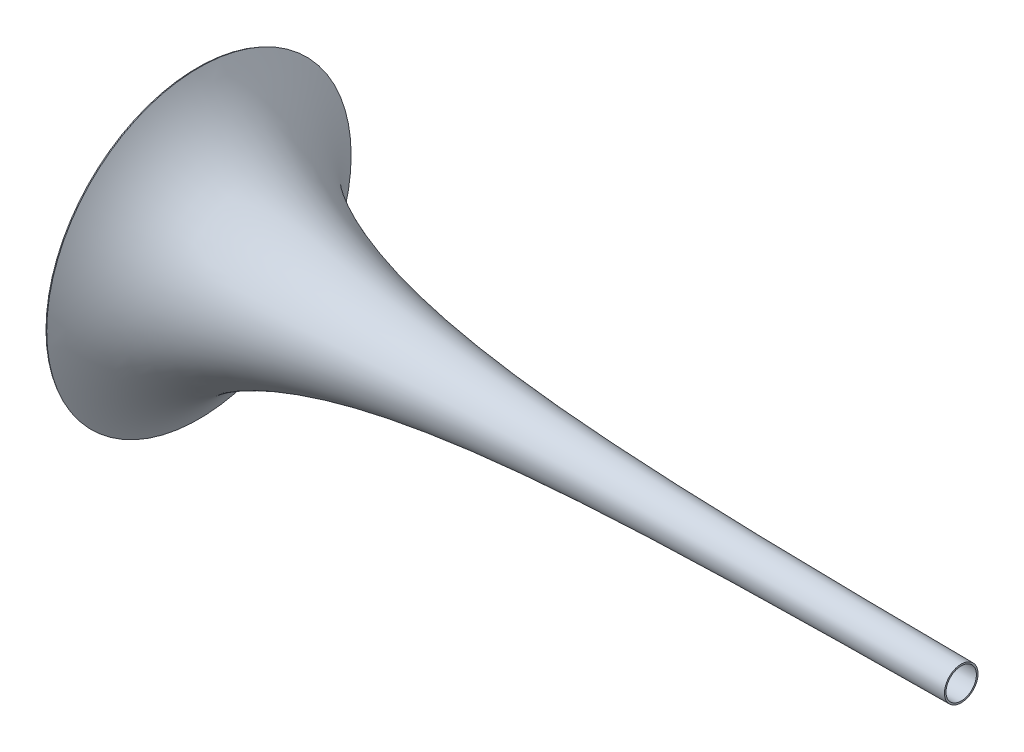
ISO-10303-21;
HEADER;
FILE_DESCRIPTION(('STEP AP214'),'2;1');
FILE_NAME('part.step','',(''),(''),'','','');
FILE_SCHEMA(('AUTOMOTIVE_DESIGN { 1 0 10303 214 1 1 1 1 }'));
ENDSEC;
DATA;
#1=APPLICATION_CONTEXT('core data for automotive mechanical design processes');
#2=APPLICATION_PROTOCOL_DEFINITION('international standard','automotive_design',2000,#1);
#3=PRODUCT_CONTEXT('',#1,'mechanical');
#4=PRODUCT('Part','Part','',(#3));
#5=PRODUCT_RELATED_PRODUCT_CATEGORY('part','',(#4));
#6=PRODUCT_DEFINITION_FORMATION('','',#4);
#7=PRODUCT_DEFINITION_CONTEXT('part definition',#1,'design');
#8=PRODUCT_DEFINITION('design','',#6,#7);
#9=PRODUCT_DEFINITION_SHAPE('','',#8);
#10=(LENGTH_UNIT() NAMED_UNIT(*) SI_UNIT(.MILLI.,.METRE.));
#11=(NAMED_UNIT(*) PLANE_ANGLE_UNIT() SI_UNIT($,.RADIAN.));
#12=(NAMED_UNIT(*) SI_UNIT($,.STERADIAN.) SOLID_ANGLE_UNIT());
#13=UNCERTAINTY_MEASURE_WITH_UNIT(LENGTH_MEASURE(1.E-05),#10,'distance_accuracy_value','');
#14=(GEOMETRIC_REPRESENTATION_CONTEXT(3) GLOBAL_UNCERTAINTY_ASSIGNED_CONTEXT((#13)) GLOBAL_UNIT_ASSIGNED_CONTEXT((#10,
#11,#12)) REPRESENTATION_CONTEXT('',''));
#15=CARTESIAN_POINT('',(0.,0.,0.));
#16=DIRECTION('',(0.,0.,1.));
#17=DIRECTION('',(1.,0.,0.));
#18=AXIS2_PLACEMENT_3D('',#15,#16,#17);
#19=CARTESIAN_POINT('',(58.3007590635035,240.362898059612,0.));
#20=CARTESIAN_POINT('',(58.3811556590823,240.208032578408,0.));
#21=CARTESIAN_POINT('',(58.4618255709949,240.05317555378,0.));
#22=CARTESIAN_POINT('',(58.6389810626078,239.714057614751,0.));
#23=CARTESIAN_POINT('',(58.7355060287095,239.529719983446,0.));
#24=CARTESIAN_POINT('',(58.9404247464375,239.139248908027,0.));
#25=CARTESIAN_POINT('',(59.0476713787615,238.93532642151,0.));
#26=CARTESIAN_POINT('',(59.2593173235424,238.534046893683,0.));
#27=CARTESIAN_POINT('',(59.3637189628084,238.336686104393,0.));
#28=CARTESIAN_POINT('',(59.6683203095675,237.762803565129,0.));
#29=CARTESIAN_POINT('',(59.8620213861742,237.400415751915,0.));
#30=CARTESIAN_POINT('',(60.2526790011554,236.673675883246,0.));
#31=CARTESIAN_POINT('',(60.449096364017,236.310365992973,0.));
#32=CARTESIAN_POINT('',(61.0454262743039,235.213331277926,0.));
#33=CARTESIAN_POINT('',(61.4491794036923,234.47876494683,0.));
#34=CARTESIAN_POINT('',(62.2602268986225,233.020407024892,0.));
#35=CARTESIAN_POINT('',(62.6690688572317,232.293635138643,0.));
#36=CARTESIAN_POINT('',(64.7324101551609,228.667372884224,0.));
#37=CARTESIAN_POINT('',(66.4403642012414,225.798396230359,0.));
#38=CARTESIAN_POINT('',(71.7379740585548,217.297751923055,0.));
#39=CARTESIAN_POINT('',(75.5021072766863,211.772879202369,0.));
#40=CARTESIAN_POINT('',(83.4850613066661,201.059860162265,0.));
#41=CARTESIAN_POINT('',(87.7037385987146,195.871972165719,0.));
#42=CARTESIAN_POINT('',(96.5617929631152,185.87117672618,0.));
#43=CARTESIAN_POINT('',(101.200867249609,181.05835887553,0.));
#44=CARTESIAN_POINT('',(110.848689135951,171.825694519124,0.));
#45=CARTESIAN_POINT('',(115.857118928575,167.405760933959,0.));
#46=CARTESIAN_POINT('',(126.185416928655,158.956722137601,0.));
#47=CARTESIAN_POINT('',(131.505063757293,154.927431216566,0.));
#48=CARTESIAN_POINT('',(142.398881913579,147.241977464485,0.));
#49=CARTESIAN_POINT('',(147.972948789719,143.585615267406,0.));
#50=CARTESIAN_POINT('',(159.325176313307,136.618849161909,0.));
#51=CARTESIAN_POINT('',(165.103310487505,133.308295545031,0.));
#52=CARTESIAN_POINT('',(182.68075255756,123.848622277309,0.));
#53=CARTESIAN_POINT('',(194.719581958526,118.170361539033,0.));
#54=CARTESIAN_POINT('',(219.196446604634,107.823630364644,0.));
#55=CARTESIAN_POINT('',(231.635829590152,103.154449762443,0.));
#56=CARTESIAN_POINT('',(256.768297125278,94.617623546846,0.));
#57=CARTESIAN_POINT('',(269.462374835359,90.750138483022,0.));
#58=CARTESIAN_POINT('',(295.015775870777,83.656061297687,0.));
#59=CARTESIAN_POINT('',(307.875707193234,80.4298010844057,0.));
#60=CARTESIAN_POINT('',(333.705738258228,74.4957044880951,0.));
#61=CARTESIAN_POINT('',(346.676181359355,71.7881587874927,0.));
#62=CARTESIAN_POINT('',(372.691928590467,66.7973155372779,0.));
#63=CARTESIAN_POINT('',(385.737429957326,64.5142298111218,0.));
#64=CARTESIAN_POINT('',(411.880069958842,60.2987643127749,0.));
#65=CARTESIAN_POINT('',(424.977319077214,58.3665357422759,0.));
#66=CARTESIAN_POINT('',(451.207807854972,54.7943531468981,0.));
#67=CARTESIAN_POINT('',(464.341130258902,53.154528880044,0.));
#68=CARTESIAN_POINT('',(503.778986411795,48.60280466089,0.));
#69=CARTESIAN_POINT('',(530.120479306056,46.0555754558742,0.));
#70=CARTESIAN_POINT('',(582.851716023541,41.6541098623076,0.));
#71=CARTESIAN_POINT('',(609.242085359218,39.8011831885346,0.));
#72=CARTESIAN_POINT('',(662.046919737057,36.5959309936685,0.));
#73=CARTESIAN_POINT('',(688.461692505241,35.2443544973711,0.));
#74=CARTESIAN_POINT('',(741.303070653338,32.9049873321992,0.));
#75=CARTESIAN_POINT('',(767.729811124051,31.9176559737006,0.));
#76=CARTESIAN_POINT('',(820.588942664535,30.2081784018472,0.));
#77=CARTESIAN_POINT('',(847.021308635307,29.4863429840032,0.));
#78=CARTESIAN_POINT('',(899.88877370163,28.2363321127112,0.));
#79=CARTESIAN_POINT('',(926.324008382258,27.7083679580588,0.));
#80=CARTESIAN_POINT('',(979.194073970992,26.7940029368593,0.));
#81=CARTESIAN_POINT('',(1005.62877944288,26.4077544337508,0.));
#82=CARTESIAN_POINT('',(1045.28548196562,25.9060047136089,0.));
#83=CARTESIAN_POINT('',(1058.50090791675,25.7518094980305,0.));
#84=CARTESIAN_POINT('',(1078.32872234412,25.5372147422712,0.));
#85=CARTESIAN_POINT('',(1084.93960528081,25.4684667624722,0.));
#86=CARTESIAN_POINT('',(1098.15894333797,25.3361461389961,0.));
#87=CARTESIAN_POINT('',(1104.7662534719,25.2725792736864,0.));
#88=CARTESIAN_POINT('',(1117.98037053389,25.1502231172637,0.));
#89=CARTESIAN_POINT('',(1124.58949355124,25.0914224602634,0.));
#90=CARTESIAN_POINT('',(1137.8141150657,24.9782059069842,0.));
#91=CARTESIAN_POINT('',(1144.42708684544,24.9238025905773,0.));
#92=CARTESIAN_POINT('',(1157.6349035445,24.8191702794917,0.));
#93=CARTESIAN_POINT('',(1164.23018732821,24.7689391135334,0.));
#94=CARTESIAN_POINT('',(1174.16330219104,24.6962262893082,0.));
#95=CARTESIAN_POINT('',(1177.48177666189,24.6724242203962,0.));
#96=CARTESIAN_POINT('',(1182.44061963226,24.6374961342071,0.));
#97=CARTESIAN_POINT('',(1185.73889814616,24.6144756760926,0.));
#98=CARTESIAN_POINT('',(1189.02279561987,24.5919720309961,0.));
#99=CARTESIAN_POINT('',(1192.30914843254,24.5696746541531,0.));
#100=CARTESIAN_POINT('',(1193.9543558184,24.5586251150736,0.));
#101=CARTESIAN_POINT('',(1197.26094637581,24.5366600860382,0.));
#102=CARTESIAN_POINT('',(1198.9224031497,24.5257442323717,0.));
#103=CARTESIAN_POINT('',(1202.25592602421,24.5040700501987,0.));
#104=CARTESIAN_POINT('',(1203.92798277912,24.4933117679871,0.));
#105=CARTESIAN_POINT('',(1207.25872319098,24.4720675693798,0.));
#106=CARTESIAN_POINT('',(1210.57209411434,24.4511155431948,0.));
#107=CARTESIAN_POINT('',(1213.82786304065,24.4308531710231,0.));
#108=CARTESIAN_POINT('',(1217.07603952908,24.4108265549705,0.));
#109=CARTESIAN_POINT('',(1218.69741110453,24.4009257698707,0.));
#110=CARTESIAN_POINT('',(1221.98085391061,24.3811167281522,0.));
#111=CARTESIAN_POINT('',(1225.30748381615,24.3612878931083,0.));
#112=CARTESIAN_POINT('',(1228.71783523298,24.3414251553358,0.));
#113=CARTESIAN_POINT('',(1232.11222683049,24.3218284420488,0.));
#114=CARTESIAN_POINT('',(1233.79554731359,24.3121923265476,0.));
#115=CARTESIAN_POINT('',(1237.07718207457,24.2935247856081,0.));
#116=CARTESIAN_POINT('',(1238.67543753232,24.2844936515101,0.));
#117=CARTESIAN_POINT('',(1241.82854114368,24.2668262766595,0.));
#118=CARTESIAN_POINT('',(1243.38390410035,24.2581874824874,0.));
#119=CARTESIAN_POINT('',(1245.78845890248,24.2450069390734,0.));
#120=CARTESIAN_POINT('',(1247.4168875378,24.2361380851561,0.));
#121=CARTESIAN_POINT('',(1249.96777987332,24.2224290474743,0.));
#122=CARTESIAN_POINT('',(1252.62813907133,24.2083069467681,0.));
#123=CARTESIAN_POINT('',(1254.45492846402,24.1987139671169,0.));
#124=CARTESIAN_POINT('',(1257.20477247859,24.1843401712367,0.));
#125=CARTESIAN_POINT('',(1259.04800089915,24.1747928192961,0.));
#126=CARTESIAN_POINT('',(1261.66084989858,24.1613499941091,0.));
#127=CARTESIAN_POINT('',(1263.35416888122,24.1526705131242,0.));
#128=CARTESIAN_POINT('',(1265.71815686696,24.1406472551907,0.));
#129=CARTESIAN_POINT('',(1267.91554341962,24.1295722145252,0.));
#130=CARTESIAN_POINT('',(1269.30208147378,24.1226581847067,0.));
#131=CARTESIAN_POINT('',(1269.99052880498,24.1192450572717,0.));
#132=B_SPLINE_CURVE_WITH_KNOTS('',3,(#19,#20,#21,#22,#23,#24,#25,#26,#27,#28,#29,#30,#31,#32,
#33,#34,#35,#36,#37,#38,#39,#40,#41,#42,#43,#44,#45,#46,#47,#48,#49,#50,#51,#52,#53,#54,#55,#56,
#57,#58,#59,#60,#61,#62,#63,#64,#65,#66,#67,#68,#69,#70,#71,#72,#73,#74,#75,#76,#77,#78,#79,#80,
#81,#82,#83,#84,#85,#86,#87,#88,#89,#90,#91,#92,#93,#94,#95,#96,#97,#98,#99,#100,#101,#102,#103,
#104,#105,#106,#107,#108,#109,#110,#111,#112,#113,#114,#115,#116,#117,#118,#119,#120,#121,#122,
#123,#124,#125,#126,#127,#128,#129,#130,#131),.UNSPECIFIED.,.F.,.F.,(4,2,2,2,2,2,2,2,2,2,2,2,2,
2,2,2,2,2,2,2,2,2,2,2,2,2,2,2,2,2,2,2,2,2,2,2,2,2,2,1,2,2,2,2,1,2,2,1,2,2,2,2,1,1,1,2,2,1,1,1,
4),(0.,0.000488281249999985,0.000976562499999969,0.00146484374999995,0.00195312499999994,
0.00292968749999992,0.00390624999999989,0.00585937499999991,0.00781249999999993,
0.0156249999999999,0.03125,0.046875,0.0625000000000001,0.0781250000000002,0.0937500000000002,
0.109375,0.125,0.15625,0.187500000000001,0.218750000000001,0.250000000000001,0.281250000000001,
0.312500000000001,0.343750000000001,0.375000000000002,0.437500000000002,0.500000000000002,
0.562500000000003,0.625000000000003,0.687500000000003,0.750000000000004,0.812500000000004,
0.843750000000004,0.859375000000004,0.875000000000004,0.890625000000004,0.906250000000004,
0.921875000000004,0.929687500000004,0.933593750000004,0.937500000000004,0.941406250000004,
0.945312500000004,0.949218750000004,0.953125000000004,0.957031250000004,0.960937500000004,
0.964843750000004,0.968750000000004,0.972656250000004,0.976562500000004,0.980468750000004,
0.982421875000003,0.984375000000003,0.986328125000003,0.988281250000003,0.992187500000002,
0.994140625000002,0.996093750000001,0.998046875000001,1.),.UNSPECIFIED.);
#133=CARTESIAN_POINT('',(0.,0.,0.));
#134=DIRECTION('',(-1.,0.,0.));
#135=AXIS1_PLACEMENT('',#133,#134);
#136=SURFACE_OF_REVOLUTION('',#132,#135);
#137=CARTESIAN_POINT('',(1269.99052880498,0.,0.));
#138=DIRECTION('',(-1.,0.,0.));
#139=DIRECTION('',(0.,0.,1.));
#140=AXIS2_PLACEMENT_3D('',#137,#138,#139);
#141=CIRCLE('',#140,24.1192450572717);
#142=CARTESIAN_POINT('',(1269.99052880498,0.,24.1192450572717));
#143=VERTEX_POINT('',#142);
#144=EDGE_CURVE('E52',#143,#143,#141,.T.);
#145=ORIENTED_EDGE('',*,*,#144,.F.);
#146=EDGE_LOOP('',(#145));
#147=FACE_BOUND('',#146,.T.);
#148=CARTESIAN_POINT('',(58.3007590635035,0.,0.));
#149=DIRECTION('',(-1.,0.,0.));
#150=DIRECTION('',(0.,0.,1.));
#151=AXIS2_PLACEMENT_3D('',#148,#149,#150);
#152=CIRCLE('',#151,240.362898059612);
#153=CARTESIAN_POINT('',(58.3007590635035,0.,240.362898059612));
#154=VERTEX_POINT('',#153);
#155=EDGE_CURVE('E10',#154,#154,#152,.T.);
#156=ORIENTED_EDGE('',*,*,#155,.T.);
#157=EDGE_LOOP('',(#156));
#158=FACE_BOUND('',#157,.T.);
#159=ADVANCED_FACE('F37',(#147,#158),#136,.T.);
#160=CARTESIAN_POINT('',(58.3007590635035,0.,0.));
#161=DIRECTION('',(1.,0.,0.));
#162=DIRECTION('',(0.,0.,-1.));
#163=AXIS2_PLACEMENT_3D('',#160,#161,#162);
#164=CONICAL_SURFACE('',#163,240.362898059612,0.478840726548642);
#165=CARTESIAN_POINT('',(60.5550843871405,0.,0.));
#166=DIRECTION('',(-1.,0.,0.));
#167=DIRECTION('',(0.,0.,1.));
#168=AXIS2_PLACEMENT_3D('',#165,#166,#167);
#169=CIRCLE('',#168,241.533204572971);
#170=CARTESIAN_POINT('',(60.5550843871405,0.,241.533204572971));
#171=VERTEX_POINT('',#170);
#172=EDGE_CURVE('E44',#171,#171,#169,.T.);
#173=ORIENTED_EDGE('',*,*,#172,.T.);
#174=EDGE_LOOP('',(#173));
#175=FACE_BOUND('',#174,.T.);
#176=ORIENTED_EDGE('',*,*,#155,.F.);
#177=EDGE_LOOP('',(#176));
#178=FACE_BOUND('',#177,.T.);
#179=ADVANCED_FACE('F71',(#175,#178),#164,.T.);
#180=CARTESIAN_POINT('',(60.5550843871405,241.533204572971,0.));
#181=CARTESIAN_POINT('',(60.6798004197543,241.292967927805,0.));
#182=CARTESIAN_POINT('',(60.9268998777238,240.819305161917,0.));
#183=CARTESIAN_POINT('',(61.4683401672404,239.786795038937,0.));
#184=CARTESIAN_POINT('',(62.075343276486,238.645508970347,0.));
#185=CARTESIAN_POINT('',(62.6814842012742,237.519999385753,0.));
#186=CARTESIAN_POINT('',(63.3054369142382,236.374376324269,0.));
#187=CARTESIAN_POINT('',(64.0901510414127,234.950997750834,0.));
#188=CARTESIAN_POINT('',(64.8832797586592,233.535331464959,0.));
#189=CARTESIAN_POINT('',(65.6870510877671,232.123272080324,0.));
#190=CARTESIAN_POINT('',(66.5001035935157,230.717616607584,0.));
#191=CARTESIAN_POINT('',(67.1564851997875,229.596287440143,0.));
#192=CARTESIAN_POINT('',(68.97750331049,226.522289621016,0.));
#193=CARTESIAN_POINT('',(71.3634190300392,222.650666100551,0.));
#194=CARTESIAN_POINT('',(75.076113106732,216.927400250088,0.));
#195=CARTESIAN_POINT('',(80.299935972225,209.481066006704,0.));
#196=CARTESIAN_POINT('',(85.7947830853089,202.230965947502,0.));
#197=CARTESIAN_POINT('',(92.4364750557776,194.232213331404,0.));
#198=CARTESIAN_POINT('',(99.4252247027236,186.534903952961,0.));
#199=CARTESIAN_POINT('',(106.747270504137,179.144019682604,0.));
#200=CARTESIAN_POINT('',(114.381585914104,172.065867259374,0.));
#201=CARTESIAN_POINT('',(121.558417054532,165.939860904545,0.));
#202=CARTESIAN_POINT('',(128.178426896589,160.671887885884,0.));
#203=CARTESIAN_POINT('',(135.458309115305,155.208136819421,0.));
#204=CARTESIAN_POINT('',(143.49275243462,149.55150037106,0.));
#205=CARTESIAN_POINT('',(153.157183859525,143.260406688952,0.));
#206=CARTESIAN_POINT('',(163.534502424247,137.091050501444,0.));
#207=CARTESIAN_POINT('',(173.161931491538,131.793754823868,0.));
#208=CARTESIAN_POINT('',(183.819222578451,126.299143534236,0.));
#209=CARTESIAN_POINT('',(196.061387051647,120.428080454601,0.));
#210=CARTESIAN_POINT('',(211.020604569677,113.885173533524,0.));
#211=CARTESIAN_POINT('',(227.226930493128,107.524529724196,0.));
#212=CARTESIAN_POINT('',(242.602057311586,102.036560222189,0.));
#213=CARTESIAN_POINT('',(256.524345971449,97.4495074708119,0.));
#214=CARTESIAN_POINT('',(268.940793208007,93.6234999774894,0.));
#215=CARTESIAN_POINT('',(284.544396614592,89.1197411833414,0.));
#216=CARTESIAN_POINT('',(303.384615921471,84.1303995241907,0.));
#217=CARTESIAN_POINT('',(325.439727512083,78.8682402047729,0.));
#218=CARTESIAN_POINT('',(350.736436941764,73.5128000027196,0.));
#219=CARTESIAN_POINT('',(376.08234178876,68.7340828176829,0.));
#220=CARTESIAN_POINT('',(401.452747554058,64.461270999231,0.));
#221=CARTESIAN_POINT('',(426.956266299502,60.616251641309,0.));
#222=CARTESIAN_POINT('',(452.579158206392,57.1533624035724,0.));
#223=CARTESIAN_POINT('',(484.759469921244,53.2506322178869,0.));
#224=CARTESIAN_POINT('',(523.524576216032,49.187444296291,0.));
#225=CARTESIAN_POINT('',(568.824962461282,45.2194739407896,0.));
#226=CARTESIAN_POINT('',(620.66344505255,41.5368820710012,0.));
#227=CARTESIAN_POINT('',(672.545565946981,38.5427713244233,0.));
#228=CARTESIAN_POINT('',(724.456501747855,36.1065045705617,0.));
#229=CARTESIAN_POINT('',(776.386363948189,34.1230885857966,0.));
#230=CARTESIAN_POINT('',(821.836112592277,32.709695531049,0.));
#231=CARTESIAN_POINT('',(860.798062528805,31.6853918156196,0.));
#232=CARTESIAN_POINT('',(893.269239392708,30.9391831946183,0.));
#233=CARTESIAN_POINT('',(919.246927135568,30.4003395408605,0.));
#234=CARTESIAN_POINT('',(945.226695510878,29.9139487478022,0.));
#235=CARTESIAN_POINT('',(971.205444447186,29.4749029690793,0.));
#236=CARTESIAN_POINT('',(997.188021740657,29.078567139284,0.));
#237=CARTESIAN_POINT('',(1023.16593083693,28.7208176336017,0.));
#238=CARTESIAN_POINT('',(1049.15293472298,28.3978314973202,0.));
#239=CARTESIAN_POINT('',(1075.12601198481,28.1063326152299,0.));
#240=CARTESIAN_POINT('',(1101.12324553194,27.8430741986231,0.));
#241=CARTESIAN_POINT('',(1127.07984939934,27.6056168488008,0.));
#242=CARTESIAN_POINT('',(1149.85811260398,27.4177333889119,0.));
#243=CARTESIAN_POINT('',(1169.2768369031,27.2702510169076,0.));
#244=CARTESIAN_POINT('',(1185.62673909473,27.1545755012023,0.));
#245=CARTESIAN_POINT('',(1198.40722188553,27.0681128143718,0.));
#246=CARTESIAN_POINT('',(1211.7941703607,26.9830076143071,0.));
#247=CARTESIAN_POINT('',(1224.10025280049,26.9074074506558,0.));
#248=CARTESIAN_POINT('',(1238.26115249477,26.8265512532477,0.));
#249=CARTESIAN_POINT('',(1249.21055860668,26.7653598314548,0.));
#250=CARTESIAN_POINT('',(1261.76593885241,26.7006005946887,0.));
#251=CARTESIAN_POINT('',(1267.29652533271,26.6726323807317,0.));
#252=CARTESIAN_POINT('',(1270.00312125287,26.6592138425634,0.));
#253=B_SPLINE_CURVE_WITH_KNOTS('',4,(#180,#181,#182,#183,#184,#185,#186,#187,#188,#189,#190,
#191,#192,#193,#194,#195,#196,#197,#198,#199,#200,#201,#202,#203,#204,#205,#206,#207,#208,#209,
#210,#211,#212,#213,#214,#215,#216,#217,#218,#219,#220,#221,#222,#223,#224,#225,#226,#227,#228,
#229,#230,#231,#232,#233,#234,#235,#236,#237,#238,#239,#240,#241,#242,#243,#244,#245,#246,#247,
#248,#249,#250,#251,#252),.UNSPECIFIED.,.F.,.F.,(5,1,1,1,1,1,1,1,1,1,1,1,1,1,1,1,1,1,1,1,1,1,1,
1,1,1,1,1,1,1,1,1,1,1,1,1,1,1,1,1,1,1,1,1,1,1,1,1,1,1,1,1,1,1,1,1,1,1,1,1,1,1,1,1,1,1,1,1,1,5),
(0.0833327020086879,0.0841859969368271,0.0850392918649664,0.0858925867931056,0.0867458817212449,
0.0875991766493841,0.0884524715775234,0.0901590614338019,0.0910123563619412,0.0918656512900804,
0.0927189462182197,0.0935722411463589,0.10039835904022,0.103811297221524,0.110637173584132,
0.117462938052047,0.124288702519961,0.131114650248271,0.13794059797658,0.144785198207519,
0.151629798438459,0.155895977878068,0.160162157317677,0.168694516196896,0.177437653826467,
0.186180791456039,0.191869051823426,0.197557312190814,0.20893383292559,0.221841992128938,
0.234750151332286,0.243282557784904,0.251814964237522,0.26034737069014,0.268879777142757,
0.285944592576671,0.303009408010585,0.319905204213805,0.336801000417024,0.353696796620244,
0.370592592823463,0.387657406668305,0.404722220513146,0.438851848202829,0.472981475702913,
0.507111103202997,0.541240729876846,0.575370356550695,0.609499982890071,0.643629609229447,
0.660694422462329,0.677759235695211,0.694824048928093,0.711888862160975,0.728953675343093,
0.746018488525212,0.76308330170733,0.780148114889448,0.797212928067782,0.814277741246116,
0.83134255442445,0.848407367602783,0.85693977419356,0.865472180784338,0.874004587375115,
0.882536993965892,0.891069400556669,0.899601807147446,0.908134213738223,0.916666620329),.UNSPECIFIED.);
#254=CARTESIAN_POINT('',(0.,0.,0.));
#255=DIRECTION('',(-1.,0.,0.));
#256=AXIS1_PLACEMENT('',#254,#255);
#257=SURFACE_OF_REVOLUTION('',#253,#256);
#258=CARTESIAN_POINT('',(1270.00312125287,0.,0.));
#259=DIRECTION('',(-1.,0.,0.));
#260=DIRECTION('',(0.,0.,1.));
#261=AXIS2_PLACEMENT_3D('',#258,#259,#260);
#262=CIRCLE('',#261,26.6592138425634);
#263=CARTESIAN_POINT('',(1270.00312125287,0.,26.6592138425634));
#264=VERTEX_POINT('',#263);
#265=EDGE_CURVE('E48',#264,#264,#262,.T.);
#266=ORIENTED_EDGE('',*,*,#265,.T.);
#267=EDGE_LOOP('',(#266));
#268=FACE_BOUND('',#267,.T.);
#269=ORIENTED_EDGE('',*,*,#172,.F.);
#270=EDGE_LOOP('',(#269));
#271=FACE_BOUND('',#270,.T.);
#272=ADVANCED_FACE('F67',(#268,#271),#257,.F.);
#273=CARTESIAN_POINT('',(1270.00312125287,0.,0.));
#274=DIRECTION('',(1.,0.,0.));
#275=DIRECTION('',(0.,0.,-1.));
#276=AXIS2_PLACEMENT_3D('',#273,#274,#275);
#277=CONICAL_SURFACE('',#276,26.6592138425634,1.56583864983543);
#278=ORIENTED_EDGE('',*,*,#144,.T.);
#279=EDGE_LOOP('',(#278));
#280=FACE_BOUND('',#279,.T.);
#281=ORIENTED_EDGE('',*,*,#265,.F.);
#282=EDGE_LOOP('',(#281));
#283=FACE_BOUND('',#282,.T.);
#284=ADVANCED_FACE('F70',(#280,#283),#277,.F.);
#285=CLOSED_SHELL('',(#159,#179,#272,#284));
#286=MANIFOLD_SOLID_BREP('B2',#285);
#287=ADVANCED_BREP_SHAPE_REPRESENTATION('',(#18,#286),#14);
#288=SHAPE_DEFINITION_REPRESENTATION(#9,#287);
ENDSEC;
END-ISO-10303-21;
